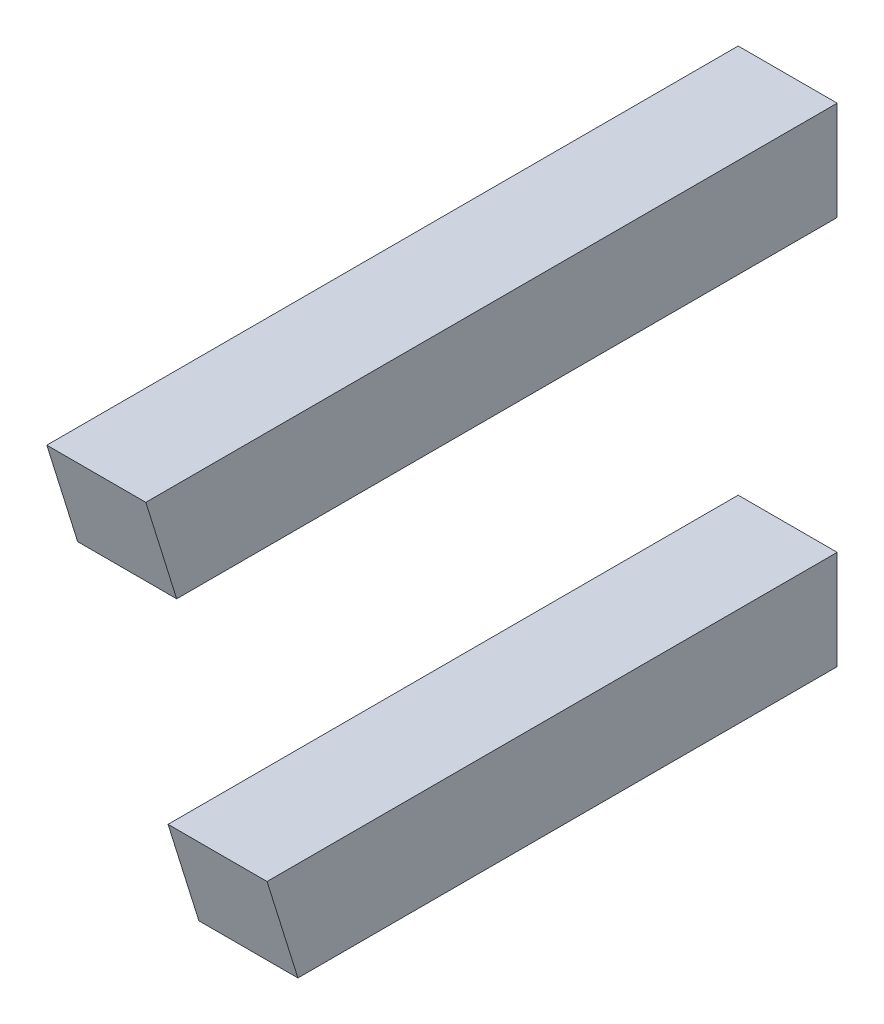
ISO-10303-21;
HEADER;
FILE_DESCRIPTION(('STEP AP214'),'2;1');
FILE_NAME('part.step','',(''),(''),'','','');
FILE_SCHEMA(('AUTOMOTIVE_DESIGN { 1 0 10303 214 1 1 1 1 }'));
ENDSEC;
DATA;
#1=APPLICATION_CONTEXT('core data for automotive mechanical design processes');
#2=APPLICATION_PROTOCOL_DEFINITION('international standard','automotive_design',2000,#1);
#3=PRODUCT_CONTEXT('',#1,'mechanical');
#4=PRODUCT('Part','Part','',(#3));
#5=PRODUCT_RELATED_PRODUCT_CATEGORY('part','',(#4));
#6=PRODUCT_DEFINITION_FORMATION('','',#4);
#7=PRODUCT_DEFINITION_CONTEXT('part definition',#1,'design');
#8=PRODUCT_DEFINITION('design','',#6,#7);
#9=PRODUCT_DEFINITION_SHAPE('','',#8);
#10=(LENGTH_UNIT() NAMED_UNIT(*) SI_UNIT(.MILLI.,.METRE.));
#11=(NAMED_UNIT(*) PLANE_ANGLE_UNIT() SI_UNIT($,.RADIAN.));
#12=(NAMED_UNIT(*) SI_UNIT($,.STERADIAN.) SOLID_ANGLE_UNIT());
#13=UNCERTAINTY_MEASURE_WITH_UNIT(LENGTH_MEASURE(1.E-05),#10,'distance_accuracy_value','');
#14=(GEOMETRIC_REPRESENTATION_CONTEXT(3) GLOBAL_UNCERTAINTY_ASSIGNED_CONTEXT((#13)) GLOBAL_UNIT_ASSIGNED_CONTEXT((#10,
#11,#12)) REPRESENTATION_CONTEXT('',''));
#15=CARTESIAN_POINT('',(0.,0.,0.));
#16=DIRECTION('',(0.,0.,1.));
#17=DIRECTION('',(1.,0.,0.));
#18=AXIS2_PLACEMENT_3D('',#15,#16,#17);
#19=CARTESIAN_POINT('',(2.8,0.,-20.));
#20=DIRECTION('',(1.,0.,0.));
#21=DIRECTION('',(0.,0.,-1.));
#22=AXIS2_PLACEMENT_3D('',#19,#20,#21);
#23=PLANE('',#22);
#24=DIRECTION('',(0.,0.,1.));
#25=VECTOR('',#24,1.);
#26=CARTESIAN_POINT('',(2.8,0.,-20.));
#27=LINE('',#26,#25);
#28=CARTESIAN_POINT('',(2.8,0.,-19.75));
#29=VERTEX_POINT('',#28);
#30=CARTESIAN_POINT('',(2.8,0.,-4.5));
#31=VERTEX_POINT('',#30);
#32=EDGE_CURVE('E165',#29,#31,#27,.T.);
#33=ORIENTED_EDGE('',*,*,#32,.F.);
#34=DIRECTION('',(0.,1.,0.));
#35=VECTOR('',#34,1.);
#36=CARTESIAN_POINT('',(2.8,2.8,-19.75));
#37=LINE('',#36,#35);
#38=CARTESIAN_POINT('',(2.8,2.8,-19.75));
#39=VERTEX_POINT('',#38);
#40=EDGE_CURVE('E13',#29,#39,#37,.T.);
#41=ORIENTED_EDGE('',*,*,#40,.T.);
#42=DIRECTION('',(0.,0.,1.));
#43=VECTOR('',#42,1.);
#44=CARTESIAN_POINT('',(2.8,2.8,-20.));
#45=LINE('',#44,#43);
#46=CARTESIAN_POINT('',(2.8,2.8,-3.62736098564418));
#47=VERTEX_POINT('',#46);
#48=EDGE_CURVE('E180',#39,#47,#45,.T.);
#49=ORIENTED_EDGE('',*,*,#48,.T.);
#50=DIRECTION('',(0.,0.95470888325457,0.297541506742862));
#51=VECTOR('',#50,1.);
#52=CARTESIAN_POINT('',(2.8,-4.40301555417758,-5.8722296976396));
#53=LINE('',#52,#51);
#54=EDGE_CURVE('E177',#31,#47,#53,.T.);
#55=ORIENTED_EDGE('',*,*,#54,.F.);
#56=EDGE_LOOP('',(#33,#41,#49,#55));
#57=FACE_BOUND('',#56,.T.);
#58=ADVANCED_FACE('F107',(#57),#23,.T.);
#59=CARTESIAN_POINT('',(0.,0.,-20.));
#60=DIRECTION('',(0.,-1.,0.));
#61=DIRECTION('',(0.,0.,-1.));
#62=AXIS2_PLACEMENT_3D('',#59,#60,#61);
#63=PLANE('',#62);
#64=DIRECTION('',(0.,0.,1.));
#65=VECTOR('',#64,1.);
#66=CARTESIAN_POINT('',(0.,0.,-20.));
#67=LINE('',#66,#65);
#68=CARTESIAN_POINT('',(0.,0.,-19.75));
#69=VERTEX_POINT('',#68);
#70=CARTESIAN_POINT('',(0.,0.,-4.5));
#71=VERTEX_POINT('',#70);
#72=EDGE_CURVE('E160',#69,#71,#67,.T.);
#73=ORIENTED_EDGE('',*,*,#72,.F.);
#74=DIRECTION('',(1.,0.,0.));
#75=VECTOR('',#74,1.);
#76=CARTESIAN_POINT('',(2.8,0.,-19.75));
#77=LINE('',#76,#75);
#78=EDGE_CURVE('E117',#69,#29,#77,.T.);
#79=ORIENTED_EDGE('',*,*,#78,.T.);
#80=ORIENTED_EDGE('',*,*,#32,.T.);
#81=DIRECTION('',(1.,0.,0.));
#82=VECTOR('',#81,1.);
#83=CARTESIAN_POINT('',(0.,0.,-4.5));
#84=LINE('',#83,#82);
#85=EDGE_CURVE('E173',#71,#31,#84,.T.);
#86=ORIENTED_EDGE('',*,*,#85,.F.);
#87=EDGE_LOOP('',(#73,#79,#80,#86));
#88=FACE_BOUND('',#87,.T.);
#89=ADVANCED_FACE('F179',(#88),#63,.T.);
#90=CARTESIAN_POINT('',(0.,0.,-20.));
#91=DIRECTION('',(1.,0.,0.));
#92=DIRECTION('',(0.,0.,-1.));
#93=AXIS2_PLACEMENT_3D('',#90,#91,#92);
#94=PLANE('',#93);
#95=DIRECTION('',(0.,0.,1.));
#96=VECTOR('',#95,1.);
#97=CARTESIAN_POINT('',(0.,2.8,-20.));
#98=LINE('',#97,#96);
#99=CARTESIAN_POINT('',(0.,2.8,-19.75));
#100=VERTEX_POINT('',#99);
#101=CARTESIAN_POINT('',(0.,2.8,-3.62736098564418));
#102=VERTEX_POINT('',#101);
#103=EDGE_CURVE('E166',#100,#102,#98,.T.);
#104=ORIENTED_EDGE('',*,*,#103,.F.);
#105=DIRECTION('',(0.,-1.,0.));
#106=VECTOR('',#105,1.);
#107=CARTESIAN_POINT('',(0.,0.,-19.75));
#108=LINE('',#107,#106);
#109=EDGE_CURVE('E132',#100,#69,#108,.T.);
#110=ORIENTED_EDGE('',*,*,#109,.T.);
#111=ORIENTED_EDGE('',*,*,#72,.T.);
#112=DIRECTION('',(0.,0.95470888325457,0.297541506742862));
#113=VECTOR('',#112,1.);
#114=CARTESIAN_POINT('',(0.,1.27829483830962,-4.10161073294334));
#115=LINE('',#114,#113);
#116=EDGE_CURVE('E163',#71,#102,#115,.T.);
#117=ORIENTED_EDGE('',*,*,#116,.T.);
#118=EDGE_LOOP('',(#104,#110,#111,#117));
#119=FACE_BOUND('',#118,.T.);
#120=ADVANCED_FACE('F162',(#119),#94,.F.);
#121=CARTESIAN_POINT('',(0.,2.8,-20.));
#122=DIRECTION('',(0.,1.,0.));
#123=DIRECTION('',(-1.,0.,0.));
#124=AXIS2_PLACEMENT_3D('',#121,#122,#123);
#125=PLANE('',#124);
#126=ORIENTED_EDGE('',*,*,#48,.F.);
#127=DIRECTION('',(-1.,0.,0.));
#128=VECTOR('',#127,1.);
#129=CARTESIAN_POINT('',(0.,2.8,-19.75));
#130=LINE('',#129,#128);
#131=EDGE_CURVE('E188',#39,#100,#130,.T.);
#132=ORIENTED_EDGE('',*,*,#131,.T.);
#133=ORIENTED_EDGE('',*,*,#103,.T.);
#134=DIRECTION('',(-1.,0.,0.));
#135=VECTOR('',#134,1.);
#136=CARTESIAN_POINT('',(0.,2.8,-3.62736098564418));
#137=LINE('',#136,#135);
#138=EDGE_CURVE('E176',#47,#102,#137,.T.);
#139=ORIENTED_EDGE('',*,*,#138,.F.);
#140=EDGE_LOOP('',(#126,#132,#133,#139));
#141=FACE_BOUND('',#140,.T.);
#142=ADVANCED_FACE('F229',(#141),#125,.T.);
#143=CARTESIAN_POINT('',(0.,0.,-20.));
#144=DIRECTION('',(0.,0.,1.));
#145=DIRECTION('',(1.,0.,0.));
#146=AXIS2_PLACEMENT_3D('',#143,#144,#145);
#147=PLANE('',#146);
#148=DIRECTION('',(0.,1.,0.));
#149=VECTOR('',#148,1.);
#150=CARTESIAN_POINT('',(0.249999999999997,0.,-20.));
#151=LINE('',#150,#149);
#152=CARTESIAN_POINT('',(0.249999999999997,0.249999999999997,-20.));
#153=VERTEX_POINT('',#152);
#154=CARTESIAN_POINT('',(0.249999999999997,2.55,-20.));
#155=VERTEX_POINT('',#154);
#156=EDGE_CURVE('E195',#153,#155,#151,.T.);
#157=ORIENTED_EDGE('',*,*,#156,.T.);
#158=DIRECTION('',(1.,0.,0.));
#159=VECTOR('',#158,1.);
#160=CARTESIAN_POINT('',(2.8,2.55,-20.));
#161=LINE('',#160,#159);
#162=CARTESIAN_POINT('',(2.55,2.55,-20.));
#163=VERTEX_POINT('',#162);
#164=EDGE_CURVE('E197',#155,#163,#161,.T.);
#165=ORIENTED_EDGE('',*,*,#164,.T.);
#166=DIRECTION('',(0.,-1.,0.));
#167=VECTOR('',#166,1.);
#168=CARTESIAN_POINT('',(2.55,0.,-20.));
#169=LINE('',#168,#167);
#170=CARTESIAN_POINT('',(2.55,0.249999999999997,-20.));
#171=VERTEX_POINT('',#170);
#172=EDGE_CURVE('E191',#163,#171,#169,.T.);
#173=ORIENTED_EDGE('',*,*,#172,.T.);
#174=DIRECTION('',(-1.,0.,0.));
#175=VECTOR('',#174,1.);
#176=CARTESIAN_POINT('',(0.,0.249999999999997,-20.));
#177=LINE('',#176,#175);
#178=EDGE_CURVE('E193',#171,#153,#177,.T.);
#179=ORIENTED_EDGE('',*,*,#178,.T.);
#180=EDGE_LOOP('',(#157,#165,#173,#179));
#181=FACE_BOUND('',#180,.T.);
#182=ADVANCED_FACE('F220',(#181),#147,.F.);
#183=CARTESIAN_POINT('',(0.,1.27829483830962,-4.10161073294334));
#184=DIRECTION('',(0.,0.297541506742862,-0.95470888325457));
#185=DIRECTION('',(0.,0.95470888325457,0.297541506742862));
#186=AXIS2_PLACEMENT_3D('',#183,#184,#185);
#187=PLANE('',#186);
#188=ORIENTED_EDGE('',*,*,#85,.T.);
#189=ORIENTED_EDGE('',*,*,#54,.T.);
#190=ORIENTED_EDGE('',*,*,#138,.T.);
#191=ORIENTED_EDGE('',*,*,#116,.F.);
#192=EDGE_LOOP('',(#188,#189,#190,#191));
#193=FACE_BOUND('',#192,.T.);
#194=ADVANCED_FACE('F171',(#193),#187,.F.);
#195=CARTESIAN_POINT('',(0.,0.,-19.75));
#196=DIRECTION('',(0.,-0.707106781186543,-0.707106781186552));
#197=DIRECTION('',(-1.,0.,0.));
#198=AXIS2_PLACEMENT_3D('',#195,#196,#197);
#199=PLANE('',#198);
#200=DIRECTION('',(-0.577350269189628,-0.577350269189628,0.57735026918962));
#201=VECTOR('',#200,1.);
#202=CARTESIAN_POINT('',(0.,0.,-19.75));
#203=LINE('',#202,#201);
#204=EDGE_CURVE('E205',#153,#69,#203,.T.);
#205=ORIENTED_EDGE('',*,*,#204,.F.);
#206=ORIENTED_EDGE('',*,*,#178,.F.);
#207=DIRECTION('',(-0.577350269189628,0.577350269189628,-0.57735026918962));
#208=VECTOR('',#207,1.);
#209=CARTESIAN_POINT('',(2.8,0.,-19.75));
#210=LINE('',#209,#208);
#211=EDGE_CURVE('E112',#29,#171,#210,.T.);
#212=ORIENTED_EDGE('',*,*,#211,.F.);
#213=ORIENTED_EDGE('',*,*,#78,.F.);
#214=EDGE_LOOP('',(#205,#206,#212,#213));
#215=FACE_BOUND('',#214,.T.);
#216=ADVANCED_FACE('F110',(#215),#199,.T.);
#217=CARTESIAN_POINT('',(2.8,0.,-19.75));
#218=DIRECTION('',(0.707106781186543,0.,-0.707106781186552));
#219=DIRECTION('',(0.,-1.,0.));
#220=AXIS2_PLACEMENT_3D('',#217,#218,#219);
#221=PLANE('',#220);
#222=ORIENTED_EDGE('',*,*,#211,.T.);
#223=ORIENTED_EDGE('',*,*,#172,.F.);
#224=DIRECTION('',(0.577350269189629,0.577350269189628,0.577350269189621));
#225=VECTOR('',#224,1.);
#226=CARTESIAN_POINT('',(1.86666666666666,1.86666666666666,-20.6833333333333));
#227=LINE('',#226,#225);
#228=EDGE_CURVE('E204',#39,#163,#227,.F.);
#229=ORIENTED_EDGE('',*,*,#228,.F.);
#230=ORIENTED_EDGE('',*,*,#40,.F.);
#231=EDGE_LOOP('',(#222,#223,#229,#230));
#232=FACE_BOUND('',#231,.T.);
#233=ADVANCED_FACE('F215',(#232),#221,.T.);
#234=CARTESIAN_POINT('',(0.249999999999997,0.,-20.));
#235=DIRECTION('',(0.707106781186543,0.,0.707106781186552));
#236=DIRECTION('',(0.,1.,0.));
#237=AXIS2_PLACEMENT_3D('',#234,#235,#236);
#238=PLANE('',#237);
#239=ORIENTED_EDGE('',*,*,#204,.T.);
#240=ORIENTED_EDGE('',*,*,#109,.F.);
#241=DIRECTION('',(-0.577350269189629,0.577350269189628,0.577350269189621));
#242=VECTOR('',#241,1.);
#243=CARTESIAN_POINT('',(1.1,1.7,-20.85));
#244=LINE('',#243,#242);
#245=EDGE_CURVE('E202',#155,#100,#244,.T.);
#246=ORIENTED_EDGE('',*,*,#245,.F.);
#247=ORIENTED_EDGE('',*,*,#156,.F.);
#248=EDGE_LOOP('',(#239,#240,#246,#247));
#249=FACE_BOUND('',#248,.T.);
#250=ADVANCED_FACE('F226',(#249),#238,.F.);
#251=CARTESIAN_POINT('',(0.,2.8,-19.75));
#252=DIRECTION('',(0.,0.707106781186543,-0.707106781186552));
#253=DIRECTION('',(1.,0.,0.));
#254=AXIS2_PLACEMENT_3D('',#251,#252,#253);
#255=PLANE('',#254);
#256=ORIENTED_EDGE('',*,*,#228,.T.);
#257=ORIENTED_EDGE('',*,*,#164,.F.);
#258=ORIENTED_EDGE('',*,*,#245,.T.);
#259=ORIENTED_EDGE('',*,*,#131,.F.);
#260=EDGE_LOOP('',(#256,#257,#258,#259));
#261=FACE_BOUND('',#260,.T.);
#262=ADVANCED_FACE('F224',(#261),#255,.T.);
#263=CLOSED_SHELL('',(#58,#89,#120,#142,#182,#194,#216,#233,#250,#262));
#264=MANIFOLD_SOLID_BREP('B2',#263);
#265=CARTESIAN_POINT('',(0.,11.,-20.));
#266=DIRECTION('',(0.,-1.,0.));
#267=DIRECTION('',(0.,0.,-1.));
#268=AXIS2_PLACEMENT_3D('',#265,#266,#267);
#269=PLANE('',#268);
#270=DIRECTION('',(0.,0.,1.));
#271=VECTOR('',#270,1.);
#272=CARTESIAN_POINT('',(0.,11.,-20.));
#273=LINE('',#272,#271);
#274=CARTESIAN_POINT('',(0.,11.,-19.75));
#275=VERTEX_POINT('',#274);
#276=CARTESIAN_POINT('',(0.,11.,-1.07177530074499));
#277=VERTEX_POINT('',#276);
#278=EDGE_CURVE('E383',#275,#277,#273,.T.);
#279=ORIENTED_EDGE('',*,*,#278,.F.);
#280=DIRECTION('',(1.,0.,0.));
#281=VECTOR('',#280,1.);
#282=CARTESIAN_POINT('',(2.8,11.,-19.75));
#283=LINE('',#282,#281);
#284=CARTESIAN_POINT('',(2.8,11.,-19.75));
#285=VERTEX_POINT('',#284);
#286=EDGE_CURVE('E105',#275,#285,#283,.T.);
#287=ORIENTED_EDGE('',*,*,#286,.T.);
#288=DIRECTION('',(0.,0.,1.));
#289=VECTOR('',#288,1.);
#290=CARTESIAN_POINT('',(2.8,11.,-20.));
#291=LINE('',#290,#289);
#292=CARTESIAN_POINT('',(2.8,11.,-1.07177530074499));
#293=VERTEX_POINT('',#292);
#294=EDGE_CURVE('E406',#285,#293,#291,.T.);
#295=ORIENTED_EDGE('',*,*,#294,.T.);
#296=DIRECTION('',(1.,0.,0.));
#297=VECTOR('',#296,1.);
#298=CARTESIAN_POINT('',(0.,11.,-1.07177530074499));
#299=LINE('',#298,#297);
#300=EDGE_CURVE('E399',#277,#293,#299,.T.);
#301=ORIENTED_EDGE('',*,*,#300,.F.);
#302=EDGE_LOOP('',(#279,#287,#295,#301));
#303=FACE_BOUND('',#302,.T.);
#304=ADVANCED_FACE('F329',(#303),#269,.T.);
#305=CARTESIAN_POINT('',(0.,0.,-20.));
#306=DIRECTION('',(1.,0.,0.));
#307=DIRECTION('',(0.,0.,-1.));
#308=AXIS2_PLACEMENT_3D('',#305,#306,#307);
#309=PLANE('',#308);
#310=DIRECTION('',(0.,0.,1.));
#311=VECTOR('',#310,1.);
#312=CARTESIAN_POINT('',(0.,13.8,-20.));
#313=LINE('',#312,#311);
#314=CARTESIAN_POINT('',(0.,13.8,-19.75));
#315=VERTEX_POINT('',#314);
#316=CARTESIAN_POINT('',(0.,13.8,-0.199136286389172));
#317=VERTEX_POINT('',#316);
#318=EDGE_CURVE('E392',#315,#317,#313,.T.);
#319=ORIENTED_EDGE('',*,*,#318,.F.);
#320=DIRECTION('',(0.,-1.,0.));
#321=VECTOR('',#320,1.);
#322=CARTESIAN_POINT('',(0.,0.,-19.75));
#323=LINE('',#322,#321);
#324=EDGE_CURVE('E340',#315,#275,#323,.T.);
#325=ORIENTED_EDGE('',*,*,#324,.T.);
#326=ORIENTED_EDGE('',*,*,#278,.T.);
#327=DIRECTION('',(0.,0.95470888325457,0.297541506742862));
#328=VECTOR('',#327,1.);
#329=CARTESIAN_POINT('',(0.,1.27829483830962,-4.10161073294334));
#330=LINE('',#329,#328);
#331=EDGE_CURVE('E386',#277,#317,#330,.T.);
#332=ORIENTED_EDGE('',*,*,#331,.T.);
#333=EDGE_LOOP('',(#319,#325,#326,#332));
#334=FACE_BOUND('',#333,.T.);
#335=ADVANCED_FACE('F385',(#334),#309,.F.);
#336=CARTESIAN_POINT('',(0.,13.8,-20.));
#337=DIRECTION('',(0.,-1.,0.));
#338=DIRECTION('',(0.,0.,-1.));
#339=AXIS2_PLACEMENT_3D('',#336,#337,#338);
#340=PLANE('',#339);
#341=DIRECTION('',(0.,0.,1.));
#342=VECTOR('',#341,1.);
#343=CARTESIAN_POINT('',(2.8,13.8,-20.));
#344=LINE('',#343,#342);
#345=CARTESIAN_POINT('',(2.8,13.8,-19.75));
#346=VERTEX_POINT('',#345);
#347=CARTESIAN_POINT('',(2.8,13.8,-0.199136286389172));
#348=VERTEX_POINT('',#347);
#349=EDGE_CURVE('E411',#346,#348,#344,.T.);
#350=ORIENTED_EDGE('',*,*,#349,.F.);
#351=DIRECTION('',(-1.,0.,0.));
#352=VECTOR('',#351,1.);
#353=CARTESIAN_POINT('',(0.,13.8,-19.75));
#354=LINE('',#353,#352);
#355=EDGE_CURVE('E355',#346,#315,#354,.T.);
#356=ORIENTED_EDGE('',*,*,#355,.T.);
#357=ORIENTED_EDGE('',*,*,#318,.T.);
#358=DIRECTION('',(1.,0.,0.));
#359=VECTOR('',#358,1.);
#360=CARTESIAN_POINT('',(0.,13.8,-0.199136286389168));
#361=LINE('',#360,#359);
#362=EDGE_CURVE('E402',#317,#348,#361,.T.);
#363=ORIENTED_EDGE('',*,*,#362,.T.);
#364=EDGE_LOOP('',(#350,#356,#357,#363));
#365=FACE_BOUND('',#364,.T.);
#366=ADVANCED_FACE('F472',(#365),#340,.F.);
#367=CARTESIAN_POINT('',(2.8,0.,-20.));
#368=DIRECTION('',(1.,0.,0.));
#369=DIRECTION('',(0.,0.,-1.));
#370=AXIS2_PLACEMENT_3D('',#367,#368,#369);
#371=PLANE('',#370);
#372=ORIENTED_EDGE('',*,*,#294,.F.);
#373=DIRECTION('',(0.,1.,0.));
#374=VECTOR('',#373,1.);
#375=CARTESIAN_POINT('',(2.8,13.8,-19.75));
#376=LINE('',#375,#374);
#377=EDGE_CURVE('E421',#285,#346,#376,.T.);
#378=ORIENTED_EDGE('',*,*,#377,.T.);
#379=ORIENTED_EDGE('',*,*,#349,.T.);
#380=DIRECTION('',(0.,0.95470888325457,0.297541506742862));
#381=VECTOR('',#380,1.);
#382=CARTESIAN_POINT('',(2.8,-4.40301555417758,-5.8722296976396));
#383=LINE('',#382,#381);
#384=EDGE_CURVE('E391',#293,#348,#383,.T.);
#385=ORIENTED_EDGE('',*,*,#384,.F.);
#386=EDGE_LOOP('',(#372,#378,#379,#385));
#387=FACE_BOUND('',#386,.T.);
#388=ADVANCED_FACE('F471',(#387),#371,.T.);
#389=CARTESIAN_POINT('',(0.,0.,-20.));
#390=DIRECTION('',(0.,0.,1.));
#391=DIRECTION('',(1.,0.,0.));
#392=AXIS2_PLACEMENT_3D('',#389,#390,#391);
#393=PLANE('',#392);
#394=DIRECTION('',(1.,0.,0.));
#395=VECTOR('',#394,1.);
#396=CARTESIAN_POINT('',(0.,13.55,-20.));
#397=LINE('',#396,#395);
#398=CARTESIAN_POINT('',(0.250000000000005,13.55,-20.));
#399=VERTEX_POINT('',#398);
#400=CARTESIAN_POINT('',(2.54999999999999,13.55,-20.));
#401=VERTEX_POINT('',#400);
#402=EDGE_CURVE('E431',#399,#401,#397,.T.);
#403=ORIENTED_EDGE('',*,*,#402,.T.);
#404=DIRECTION('',(0.,-1.,0.));
#405=VECTOR('',#404,1.);
#406=CARTESIAN_POINT('',(2.54999999999999,11.,-20.));
#407=LINE('',#406,#405);
#408=CARTESIAN_POINT('',(2.54999999999999,11.25,-20.));
#409=VERTEX_POINT('',#408);
#410=EDGE_CURVE('E434',#401,#409,#407,.T.);
#411=ORIENTED_EDGE('',*,*,#410,.T.);
#412=DIRECTION('',(-1.,0.,0.));
#413=VECTOR('',#412,1.);
#414=CARTESIAN_POINT('',(0.,11.25,-20.));
#415=LINE('',#414,#413);
#416=CARTESIAN_POINT('',(0.250000000000005,11.25,-20.));
#417=VERTEX_POINT('',#416);
#418=EDGE_CURVE('E425',#409,#417,#415,.T.);
#419=ORIENTED_EDGE('',*,*,#418,.T.);
#420=DIRECTION('',(0.,1.,0.));
#421=VECTOR('',#420,1.);
#422=CARTESIAN_POINT('',(0.250000000000005,0.,-20.));
#423=LINE('',#422,#421);
#424=EDGE_CURVE('E428',#417,#399,#423,.T.);
#425=ORIENTED_EDGE('',*,*,#424,.T.);
#426=EDGE_LOOP('',(#403,#411,#419,#425));
#427=FACE_BOUND('',#426,.T.);
#428=ADVANCED_FACE('F463',(#427),#393,.F.);
#429=CARTESIAN_POINT('',(0.,1.27829483830962,-4.10161073294334));
#430=DIRECTION('',(0.,0.297541506742862,-0.95470888325457));
#431=DIRECTION('',(0.,0.95470888325457,0.297541506742862));
#432=AXIS2_PLACEMENT_3D('',#429,#430,#431);
#433=PLANE('',#432);
#434=ORIENTED_EDGE('',*,*,#300,.T.);
#435=ORIENTED_EDGE('',*,*,#384,.T.);
#436=ORIENTED_EDGE('',*,*,#362,.F.);
#437=ORIENTED_EDGE('',*,*,#331,.F.);
#438=EDGE_LOOP('',(#434,#435,#436,#437));
#439=FACE_BOUND('',#438,.T.);
#440=ADVANCED_FACE('F397',(#439),#433,.F.);
#441=CARTESIAN_POINT('',(0.250000000000005,0.,-20.));
#442=DIRECTION('',(0.70710678118655,0.,0.707106781186545));
#443=DIRECTION('',(0.,1.,0.));
#444=AXIS2_PLACEMENT_3D('',#441,#442,#443);
#445=PLANE('',#444);
#446=DIRECTION('',(0.577350269189624,-0.577350269189624,-0.577350269189629));
#447=VECTOR('',#446,1.);
#448=CARTESIAN_POINT('',(4.76666666666665,9.03333333333335,-24.5166666666667));
#449=LINE('',#448,#447);
#450=EDGE_CURVE('E447',#399,#315,#449,.F.);
#451=ORIENTED_EDGE('',*,*,#450,.F.);
#452=ORIENTED_EDGE('',*,*,#424,.F.);
#453=DIRECTION('',(-0.577350269189624,-0.577350269189624,0.577350269189629));
#454=VECTOR('',#453,1.);
#455=CARTESIAN_POINT('',(0.,11.,-19.75));
#456=LINE('',#455,#454);
#457=EDGE_CURVE('E334',#275,#417,#456,.F.);
#458=ORIENTED_EDGE('',*,*,#457,.F.);
#459=ORIENTED_EDGE('',*,*,#324,.F.);
#460=EDGE_LOOP('',(#451,#452,#458,#459));
#461=FACE_BOUND('',#460,.T.);
#462=ADVANCED_FACE('F332',(#461),#445,.F.);
#463=CARTESIAN_POINT('',(0.,11.,-19.75));
#464=DIRECTION('',(0.,-0.70710678118655,-0.707106781186545));
#465=DIRECTION('',(-1.,0.,0.));
#466=AXIS2_PLACEMENT_3D('',#463,#464,#465);
#467=PLANE('',#466);
#468=ORIENTED_EDGE('',*,*,#457,.T.);
#469=ORIENTED_EDGE('',*,*,#418,.F.);
#470=DIRECTION('',(0.577350269189624,-0.577350269189624,0.577350269189629));
#471=VECTOR('',#470,1.);
#472=CARTESIAN_POINT('',(1.86666666666667,11.9333333333333,-20.6833333333333));
#473=LINE('',#472,#471);
#474=EDGE_CURVE('E445',#285,#409,#473,.F.);
#475=ORIENTED_EDGE('',*,*,#474,.F.);
#476=ORIENTED_EDGE('',*,*,#286,.F.);
#477=EDGE_LOOP('',(#468,#469,#475,#476));
#478=FACE_BOUND('',#477,.T.);
#479=ADVANCED_FACE('F458',(#478),#467,.T.);
#480=CARTESIAN_POINT('',(0.,13.55,-20.));
#481=DIRECTION('',(0.,-0.70710678118655,0.707106781186545));
#482=DIRECTION('',(1.,0.,0.));
#483=AXIS2_PLACEMENT_3D('',#480,#481,#482);
#484=PLANE('',#483);
#485=ORIENTED_EDGE('',*,*,#450,.T.);
#486=ORIENTED_EDGE('',*,*,#355,.F.);
#487=DIRECTION('',(0.577350269189624,0.577350269189624,0.577350269189629));
#488=VECTOR('',#487,1.);
#489=CARTESIAN_POINT('',(1.7,12.7,-20.85));
#490=LINE('',#489,#488);
#491=EDGE_CURVE('E442',#401,#346,#490,.T.);
#492=ORIENTED_EDGE('',*,*,#491,.F.);
#493=ORIENTED_EDGE('',*,*,#402,.F.);
#494=EDGE_LOOP('',(#485,#486,#492,#493));
#495=FACE_BOUND('',#494,.T.);
#496=ADVANCED_FACE('F469',(#495),#484,.F.);
#497=CARTESIAN_POINT('',(2.8,0.,-19.75));
#498=DIRECTION('',(0.70710678118655,0.,-0.707106781186545));
#499=DIRECTION('',(0.,-1.,0.));
#500=AXIS2_PLACEMENT_3D('',#497,#498,#499);
#501=PLANE('',#500);
#502=ORIENTED_EDGE('',*,*,#474,.T.);
#503=ORIENTED_EDGE('',*,*,#410,.F.);
#504=ORIENTED_EDGE('',*,*,#491,.T.);
#505=ORIENTED_EDGE('',*,*,#377,.F.);
#506=EDGE_LOOP('',(#502,#503,#504,#505));
#507=FACE_BOUND('',#506,.T.);
#508=ADVANCED_FACE('F467',(#507),#501,.T.);
#509=CLOSED_SHELL('',(#304,#335,#366,#388,#428,#440,#462,#479,#496,#508));
#510=MANIFOLD_SOLID_BREP('B7',#509);
#511=ADVANCED_BREP_SHAPE_REPRESENTATION('',(#18,#264,#510),#14);
#512=SHAPE_DEFINITION_REPRESENTATION(#9,#511);
ENDSEC;
END-ISO-10303-21;
